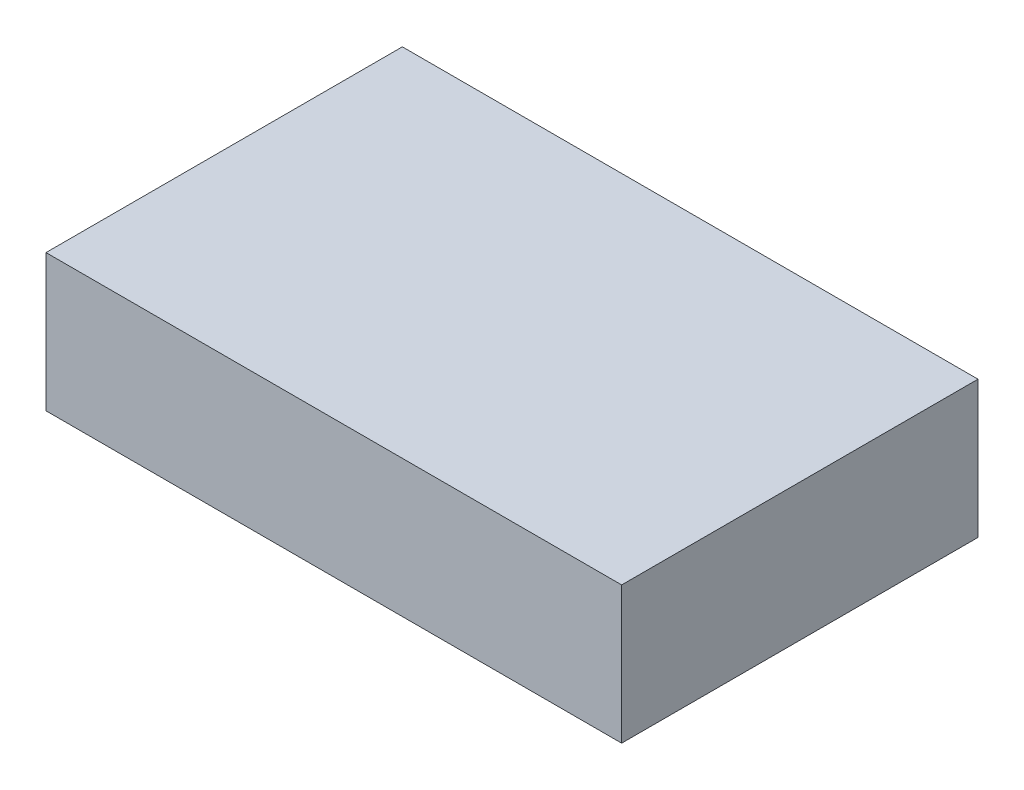
ISO-10303-21;
HEADER;
FILE_DESCRIPTION(('STEP AP214'),'2;1');
FILE_NAME('part.step','',(''),(''),'','','');
FILE_SCHEMA(('AUTOMOTIVE_DESIGN { 1 0 10303 214 1 1 1 1 }'));
ENDSEC;
DATA;
#1=APPLICATION_CONTEXT('core data for automotive mechanical design processes');
#2=APPLICATION_PROTOCOL_DEFINITION('international standard','automotive_design',2000,#1);
#3=PRODUCT_CONTEXT('',#1,'mechanical');
#4=PRODUCT('Part','Part','',(#3));
#5=PRODUCT_RELATED_PRODUCT_CATEGORY('part','',(#4));
#6=PRODUCT_DEFINITION_FORMATION('','',#4);
#7=PRODUCT_DEFINITION_CONTEXT('part definition',#1,'design');
#8=PRODUCT_DEFINITION('design','',#6,#7);
#9=PRODUCT_DEFINITION_SHAPE('','',#8);
#10=(LENGTH_UNIT() NAMED_UNIT(*) SI_UNIT(.MILLI.,.METRE.));
#11=(NAMED_UNIT(*) PLANE_ANGLE_UNIT() SI_UNIT($,.RADIAN.));
#12=(NAMED_UNIT(*) SI_UNIT($,.STERADIAN.) SOLID_ANGLE_UNIT());
#13=UNCERTAINTY_MEASURE_WITH_UNIT(LENGTH_MEASURE(1.E-05),#10,'distance_accuracy_value','');
#14=(GEOMETRIC_REPRESENTATION_CONTEXT(3) GLOBAL_UNCERTAINTY_ASSIGNED_CONTEXT((#13)) GLOBAL_UNIT_ASSIGNED_CONTEXT((#10,
#11,#12)) REPRESENTATION_CONTEXT('',''));
#15=CARTESIAN_POINT('',(0.,0.,0.));
#16=DIRECTION('',(0.,0.,1.));
#17=DIRECTION('',(1.,0.,0.));
#18=AXIS2_PLACEMENT_3D('',#15,#16,#17);
#19=CARTESIAN_POINT('',(21.,10.,-13.));
#20=DIRECTION('',(-1.,0.,0.));
#21=DIRECTION('',(0.,0.,1.));
#22=AXIS2_PLACEMENT_3D('',#19,#20,#21);
#23=PLANE('',#22);
#24=DIRECTION('',(0.,0.,-1.));
#25=VECTOR('',#24,1.);
#26=CARTESIAN_POINT('',(21.,0.,-13.));
#27=LINE('',#26,#25);
#28=CARTESIAN_POINT('',(21.,0.,13.));
#29=VERTEX_POINT('',#28);
#30=CARTESIAN_POINT('',(21.,0.,-13.));
#31=VERTEX_POINT('',#30);
#32=EDGE_CURVE('E98',#29,#31,#27,.T.);
#33=ORIENTED_EDGE('',*,*,#32,.T.);
#34=DIRECTION('',(0.,-1.,0.));
#35=VECTOR('',#34,1.);
#36=CARTESIAN_POINT('',(21.,10.,-13.));
#37=LINE('',#36,#35);
#38=CARTESIAN_POINT('',(21.,10.,-13.));
#39=VERTEX_POINT('',#38);
#40=EDGE_CURVE('E11',#39,#31,#37,.T.);
#41=ORIENTED_EDGE('',*,*,#40,.F.);
#42=DIRECTION('',(0.,0.,-1.));
#43=VECTOR('',#42,1.);
#44=CARTESIAN_POINT('',(21.,10.,-13.));
#45=LINE('',#44,#43);
#46=CARTESIAN_POINT('',(21.,10.,13.));
#47=VERTEX_POINT('',#46);
#48=EDGE_CURVE('E86',#47,#39,#45,.T.);
#49=ORIENTED_EDGE('',*,*,#48,.F.);
#50=DIRECTION('',(0.,-1.,0.));
#51=VECTOR('',#50,1.);
#52=CARTESIAN_POINT('',(21.,10.,13.));
#53=LINE('',#52,#51);
#54=EDGE_CURVE('E94',#47,#29,#53,.T.);
#55=ORIENTED_EDGE('',*,*,#54,.T.);
#56=EDGE_LOOP('',(#33,#41,#49,#55));
#57=FACE_BOUND('',#56,.T.);
#58=ADVANCED_FACE('F35',(#57),#23,.F.);
#59=CARTESIAN_POINT('',(-21.,10.,-13.));
#60=DIRECTION('',(0.,0.,1.));
#61=DIRECTION('',(1.,0.,0.));
#62=AXIS2_PLACEMENT_3D('',#59,#60,#61);
#63=PLANE('',#62);
#64=DIRECTION('',(-1.,0.,0.));
#65=VECTOR('',#64,1.);
#66=CARTESIAN_POINT('',(-21.,0.,-13.));
#67=LINE('',#66,#65);
#68=CARTESIAN_POINT('',(-21.,0.,-13.));
#69=VERTEX_POINT('',#68);
#70=EDGE_CURVE('E90',#31,#69,#67,.T.);
#71=ORIENTED_EDGE('',*,*,#70,.T.);
#72=DIRECTION('',(0.,-1.,0.));
#73=VECTOR('',#72,1.);
#74=CARTESIAN_POINT('',(-21.,10.,-13.));
#75=LINE('',#74,#73);
#76=CARTESIAN_POINT('',(-21.,10.,-13.));
#77=VERTEX_POINT('',#76);
#78=EDGE_CURVE('E43',#77,#69,#75,.T.);
#79=ORIENTED_EDGE('',*,*,#78,.F.);
#80=DIRECTION('',(-1.,0.,0.));
#81=VECTOR('',#80,1.);
#82=CARTESIAN_POINT('',(-21.,10.,-13.));
#83=LINE('',#82,#81);
#84=EDGE_CURVE('E81',#39,#77,#83,.T.);
#85=ORIENTED_EDGE('',*,*,#84,.F.);
#86=ORIENTED_EDGE('',*,*,#40,.T.);
#87=EDGE_LOOP('',(#71,#79,#85,#86));
#88=FACE_BOUND('',#87,.T.);
#89=ADVANCED_FACE('F89',(#88),#63,.F.);
#90=CARTESIAN_POINT('',(-21.,10.,-13.));
#91=DIRECTION('',(1.,0.,0.));
#92=DIRECTION('',(0.,0.,-1.));
#93=AXIS2_PLACEMENT_3D('',#90,#91,#92);
#94=PLANE('',#93);
#95=DIRECTION('',(0.,0.,1.));
#96=VECTOR('',#95,1.);
#97=CARTESIAN_POINT('',(-21.,0.,-13.));
#98=LINE('',#97,#96);
#99=CARTESIAN_POINT('',(-21.,0.,13.));
#100=VERTEX_POINT('',#99);
#101=EDGE_CURVE('E68',#69,#100,#98,.T.);
#102=ORIENTED_EDGE('',*,*,#101,.T.);
#103=DIRECTION('',(0.,-1.,0.));
#104=VECTOR('',#103,1.);
#105=CARTESIAN_POINT('',(-21.,10.,13.));
#106=LINE('',#105,#104);
#107=CARTESIAN_POINT('',(-21.,10.,13.));
#108=VERTEX_POINT('',#107);
#109=EDGE_CURVE('E91',#108,#100,#106,.T.);
#110=ORIENTED_EDGE('',*,*,#109,.F.);
#111=DIRECTION('',(0.,0.,1.));
#112=VECTOR('',#111,1.);
#113=CARTESIAN_POINT('',(-21.,10.,-13.));
#114=LINE('',#113,#112);
#115=EDGE_CURVE('E84',#77,#108,#114,.T.);
#116=ORIENTED_EDGE('',*,*,#115,.F.);
#117=ORIENTED_EDGE('',*,*,#78,.T.);
#118=EDGE_LOOP('',(#102,#110,#116,#117));
#119=FACE_BOUND('',#118,.T.);
#120=ADVANCED_FACE('F92',(#119),#94,.F.);
#121=CARTESIAN_POINT('',(-21.,10.,13.));
#122=DIRECTION('',(0.,0.,-1.));
#123=DIRECTION('',(-1.,0.,0.));
#124=AXIS2_PLACEMENT_3D('',#121,#122,#123);
#125=PLANE('',#124);
#126=DIRECTION('',(1.,0.,0.));
#127=VECTOR('',#126,1.);
#128=CARTESIAN_POINT('',(-21.,0.,13.));
#129=LINE('',#128,#127);
#130=EDGE_CURVE('E74',#100,#29,#129,.T.);
#131=ORIENTED_EDGE('',*,*,#130,.T.);
#132=ORIENTED_EDGE('',*,*,#54,.F.);
#133=DIRECTION('',(1.,0.,0.));
#134=VECTOR('',#133,1.);
#135=CARTESIAN_POINT('',(-21.,10.,13.));
#136=LINE('',#135,#134);
#137=EDGE_CURVE('E51',#108,#47,#136,.T.);
#138=ORIENTED_EDGE('',*,*,#137,.F.);
#139=ORIENTED_EDGE('',*,*,#109,.T.);
#140=EDGE_LOOP('',(#131,#132,#138,#139));
#141=FACE_BOUND('',#140,.T.);
#142=ADVANCED_FACE('F105',(#141),#125,.F.);
#143=CARTESIAN_POINT('',(0.,10.,0.));
#144=DIRECTION('',(0.,1.,0.));
#145=DIRECTION('',(0.,0.,1.));
#146=AXIS2_PLACEMENT_3D('',#143,#144,#145);
#147=PLANE('',#146);
#148=ORIENTED_EDGE('',*,*,#48,.T.);
#149=ORIENTED_EDGE('',*,*,#84,.T.);
#150=ORIENTED_EDGE('',*,*,#115,.T.);
#151=ORIENTED_EDGE('',*,*,#137,.T.);
#152=EDGE_LOOP('',(#148,#149,#150,#151));
#153=FACE_BOUND('',#152,.T.);
#154=ADVANCED_FACE('F82',(#153),#147,.T.);
#155=CARTESIAN_POINT('',(0.,0.,0.));
#156=DIRECTION('',(0.,1.,0.));
#157=DIRECTION('',(0.,0.,1.));
#158=AXIS2_PLACEMENT_3D('',#155,#156,#157);
#159=PLANE('',#158);
#160=ORIENTED_EDGE('',*,*,#32,.F.);
#161=ORIENTED_EDGE('',*,*,#130,.F.);
#162=ORIENTED_EDGE('',*,*,#101,.F.);
#163=ORIENTED_EDGE('',*,*,#70,.F.);
#164=EDGE_LOOP('',(#160,#161,#162,#163));
#165=FACE_BOUND('',#164,.T.);
#166=ADVANCED_FACE('F108',(#165),#159,.F.);
#167=CLOSED_SHELL('',(#58,#89,#120,#142,#154,#166));
#168=MANIFOLD_SOLID_BREP('B2',#167);
#169=ADVANCED_BREP_SHAPE_REPRESENTATION('',(#18,#168),#14);
#170=SHAPE_DEFINITION_REPRESENTATION(#9,#169);
ENDSEC;
END-ISO-10303-21;
